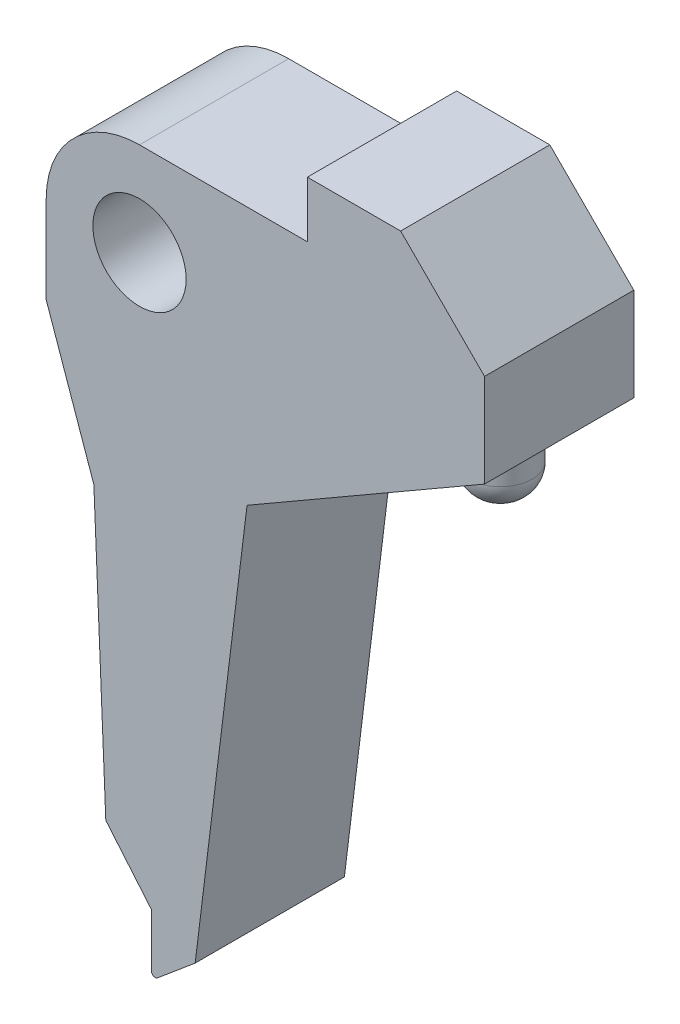
ISO-10303-21;
HEADER;
FILE_DESCRIPTION(('STEP AP214'),'2;1');
FILE_NAME('part.step','',(''),(''),'','','');
FILE_SCHEMA(('AUTOMOTIVE_DESIGN { 1 0 10303 214 1 1 1 1 }'));
ENDSEC;
DATA;
#1=APPLICATION_CONTEXT('core data for automotive mechanical design processes');
#2=APPLICATION_PROTOCOL_DEFINITION('international standard','automotive_design',2000,#1);
#3=PRODUCT_CONTEXT('',#1,'mechanical');
#4=PRODUCT('Part','Part','',(#3));
#5=PRODUCT_RELATED_PRODUCT_CATEGORY('part','',(#4));
#6=PRODUCT_DEFINITION_FORMATION('','',#4);
#7=PRODUCT_DEFINITION_CONTEXT('part definition',#1,'design');
#8=PRODUCT_DEFINITION('design','',#6,#7);
#9=PRODUCT_DEFINITION_SHAPE('','',#8);
#10=(LENGTH_UNIT() NAMED_UNIT(*) SI_UNIT(.MILLI.,.METRE.));
#11=(NAMED_UNIT(*) PLANE_ANGLE_UNIT() SI_UNIT($,.RADIAN.));
#12=(NAMED_UNIT(*) SI_UNIT($,.STERADIAN.) SOLID_ANGLE_UNIT());
#13=UNCERTAINTY_MEASURE_WITH_UNIT(LENGTH_MEASURE(1.E-05),#10,'distance_accuracy_value','');
#14=(GEOMETRIC_REPRESENTATION_CONTEXT(3) GLOBAL_UNCERTAINTY_ASSIGNED_CONTEXT((#13)) GLOBAL_UNIT_ASSIGNED_CONTEXT((#10,
#11,#12)) REPRESENTATION_CONTEXT('',''));
#15=CARTESIAN_POINT('',(0.,0.,0.));
#16=DIRECTION('',(0.,0.,1.));
#17=DIRECTION('',(1.,0.,0.));
#18=AXIS2_PLACEMENT_3D('',#15,#16,#17);
#19=CARTESIAN_POINT('',(0.839599880124929,-33.039815980547,8.));
#20=DIRECTION('',(0.,0.,-1.));
#21=DIRECTION('',(-1.,0.,0.));
#22=AXIS2_PLACEMENT_3D('',#19,#20,#21);
#23=PLANE('',#22);
#24=CARTESIAN_POINT('',(0.839599880124929,-33.039815980547,8.));
#25=DIRECTION('',(0.,0.,1.));
#26=DIRECTION('',(-1.,0.,0.));
#27=AXIS2_PLACEMENT_3D('',#24,#25,#26);
#28=CIRCLE('',#27,0.199999999999998);
#29=CARTESIAN_POINT('',(0.639599880124929,-33.039815980547,8.));
#30=VERTEX_POINT('',#29);
#31=CARTESIAN_POINT('',(0.968172025400115,-33.1930125975441,8.));
#32=VERTEX_POINT('',#31);
#33=EDGE_CURVE('E202',#30,#32,#28,.T.);
#34=ORIENTED_EDGE('',*,*,#33,.T.);
#35=DIRECTION('',(0.76598308498519,0.642860726375917,0.));
#36=VECTOR('',#35,1.);
#37=CARTESIAN_POINT('',(2.98543479971255,-31.5,8.));
#38=LINE('',#37,#36);
#39=CARTESIAN_POINT('',(2.98543479971255,-31.5,8.));
#40=VERTEX_POINT('',#39);
#41=EDGE_CURVE('E115',#32,#40,#38,.T.);
#42=ORIENTED_EDGE('',*,*,#41,.T.);
#43=DIRECTION('',(0.121869343405141,0.992546151641323,0.));
#44=VECTOR('',#43,1.);
#45=CARTESIAN_POINT('',(5.76628220120397,-8.85181539891967,8.));
#46=LINE('',#45,#44);
#47=CARTESIAN_POINT('',(5.76628220120397,-8.85181539891967,8.));
#48=VERTEX_POINT('',#47);
#49=EDGE_CURVE('E327',#40,#48,#46,.T.);
#50=ORIENTED_EDGE('',*,*,#49,.T.);
#51=DIRECTION('',(0.866025403784438,0.500000000000001,0.));
#52=VECTOR('',#51,1.);
#53=CARTESIAN_POINT('',(18.5,-1.5,8.));
#54=LINE('',#53,#52);
#55=CARTESIAN_POINT('',(18.5,-1.5,8.));
#56=VERTEX_POINT('',#55);
#57=EDGE_CURVE('E329',#48,#56,#54,.T.);
#58=ORIENTED_EDGE('',*,*,#57,.T.);
#59=DIRECTION('',(0.,1.,0.));
#60=VECTOR('',#59,1.);
#61=CARTESIAN_POINT('',(18.5,3.5,8.));
#62=LINE('',#61,#60);
#63=CARTESIAN_POINT('',(18.5,3.5,8.));
#64=VERTEX_POINT('',#63);
#65=EDGE_CURVE('E331',#56,#64,#62,.T.);
#66=ORIENTED_EDGE('',*,*,#65,.T.);
#67=DIRECTION('',(-0.707106781186551,0.707106781186544,0.));
#68=VECTOR('',#67,1.);
#69=CARTESIAN_POINT('',(14.,8.,8.));
#70=LINE('',#69,#68);
#71=CARTESIAN_POINT('',(14.,8.,8.));
#72=VERTEX_POINT('',#71);
#73=EDGE_CURVE('E337',#64,#72,#70,.T.);
#74=ORIENTED_EDGE('',*,*,#73,.T.);
#75=DIRECTION('',(-1.,0.,0.));
#76=VECTOR('',#75,1.);
#77=CARTESIAN_POINT('',(9.,8.,8.));
#78=LINE('',#77,#76);
#79=CARTESIAN_POINT('',(9.,8.,8.));
#80=VERTEX_POINT('',#79);
#81=EDGE_CURVE('E339',#72,#80,#78,.T.);
#82=ORIENTED_EDGE('',*,*,#81,.T.);
#83=DIRECTION('',(0.,-1.,0.));
#84=VECTOR('',#83,1.);
#85=CARTESIAN_POINT('',(9.,5.,8.));
#86=LINE('',#85,#84);
#87=CARTESIAN_POINT('',(9.,5.,8.));
#88=VERTEX_POINT('',#87);
#89=EDGE_CURVE('E341',#80,#88,#86,.T.);
#90=ORIENTED_EDGE('',*,*,#89,.T.);
#91=DIRECTION('',(-1.,0.,0.));
#92=VECTOR('',#91,1.);
#93=CARTESIAN_POINT('',(0.,5.,8.));
#94=LINE('',#93,#92);
#95=CARTESIAN_POINT('',(0.,5.,8.));
#96=VERTEX_POINT('',#95);
#97=EDGE_CURVE('E343',#88,#96,#94,.T.);
#98=ORIENTED_EDGE('',*,*,#97,.T.);
#99=CARTESIAN_POINT('',(0.,0.,8.));
#100=DIRECTION('',(0.,0.,1.));
#101=DIRECTION('',(1.,0.,0.));
#102=AXIS2_PLACEMENT_3D('',#99,#100,#101);
#103=CIRCLE('',#102,5.);
#104=CARTESIAN_POINT('',(-5.,0.,8.));
#105=VERTEX_POINT('',#104);
#106=EDGE_CURVE('E345',#96,#105,#103,.T.);
#107=ORIENTED_EDGE('',*,*,#106,.T.);
#108=DIRECTION('',(0.,-1.,0.));
#109=VECTOR('',#108,1.);
#110=CARTESIAN_POINT('',(-5.,-4.69657413374414,8.));
#111=LINE('',#110,#109);
#112=CARTESIAN_POINT('',(-5.,-4.69657413374414,8.));
#113=VERTEX_POINT('',#112);
#114=EDGE_CURVE('E347',#105,#113,#111,.T.);
#115=ORIENTED_EDGE('',*,*,#114,.T.);
#116=DIRECTION('',(0.330146334418636,-0.943929763208014,0.));
#117=VECTOR('',#116,1.);
#118=CARTESIAN_POINT('',(-2.44557341825096,-12.,8.));
#119=LINE('',#118,#117);
#120=CARTESIAN_POINT('',(-2.44557341825096,-12.,8.));
#121=VERTEX_POINT('',#120);
#122=EDGE_CURVE('E155',#113,#121,#119,.T.);
#123=ORIENTED_EDGE('',*,*,#122,.T.);
#124=DIRECTION('',(0.0418663292683817,-0.999123220865971,0.));
#125=VECTOR('',#124,1.);
#126=CARTESIAN_POINT('',(-1.8057349141197,-27.2694902622974,8.));
#127=LINE('',#126,#125);
#128=CARTESIAN_POINT('',(-1.8057349141197,-27.2694902622974,8.));
#129=VERTEX_POINT('',#128);
#130=EDGE_CURVE('E149',#121,#129,#127,.T.);
#131=ORIENTED_EDGE('',*,*,#130,.T.);
#132=DIRECTION('',(0.642787609686544,-0.766044443118974,0.));
#133=VECTOR('',#132,1.);
#134=CARTESIAN_POINT('',(0.639599880124929,-30.183726788434,8.));
#135=LINE('',#134,#133);
#136=CARTESIAN_POINT('',(0.639599880124929,-30.183726788434,8.));
#137=VERTEX_POINT('',#136);
#138=EDGE_CURVE('E153',#129,#137,#135,.T.);
#139=ORIENTED_EDGE('',*,*,#138,.T.);
#140=DIRECTION('',(0.,-1.,0.));
#141=VECTOR('',#140,1.);
#142=CARTESIAN_POINT('',(0.639599880124929,-33.039815980547,8.));
#143=LINE('',#142,#141);
#144=EDGE_CURVE('E50',#137,#30,#143,.T.);
#145=ORIENTED_EDGE('',*,*,#144,.T.);
#146=EDGE_LOOP('',(#34,#42,#50,#58,#66,#74,#82,#90,#98,#107,#115,#123,#131,#139,#145));
#147=FACE_BOUND('',#146,.T.);
#148=CARTESIAN_POINT('',(0.,0.,8.));
#149=DIRECTION('',(0.,0.,1.));
#150=DIRECTION('',(1.,0.,0.));
#151=AXIS2_PLACEMENT_3D('',#148,#149,#150);
#152=CIRCLE('',#151,2.5);
#153=CARTESIAN_POINT('',(2.5,0.,8.));
#154=VERTEX_POINT('',#153);
#155=EDGE_CURVE('E177',#154,#154,#152,.T.);
#156=ORIENTED_EDGE('',*,*,#155,.F.);
#157=EDGE_LOOP('',(#156));
#158=FACE_BOUND('',#157,.T.);
#159=ADVANCED_FACE('F33',(#147,#158),#23,.F.);
#160=CARTESIAN_POINT('',(0.839599880124929,-33.039815980547,0.));
#161=DIRECTION('',(0.,0.,-1.));
#162=DIRECTION('',(-1.,0.,0.));
#163=AXIS2_PLACEMENT_3D('',#160,#161,#162);
#164=PLANE('',#163);
#165=CARTESIAN_POINT('',(0.839599880124929,-33.039815980547,0.));
#166=DIRECTION('',(0.,0.,1.));
#167=DIRECTION('',(-1.,0.,0.));
#168=AXIS2_PLACEMENT_3D('',#165,#166,#167);
#169=CIRCLE('',#168,0.199999999999998);
#170=CARTESIAN_POINT('',(0.639599880124929,-33.039815980547,0.));
#171=VERTEX_POINT('',#170);
#172=CARTESIAN_POINT('',(0.968172025400115,-33.1930125975441,0.));
#173=VERTEX_POINT('',#172);
#174=EDGE_CURVE('E173',#171,#173,#169,.T.);
#175=ORIENTED_EDGE('',*,*,#174,.F.);
#176=DIRECTION('',(0.,-1.,0.));
#177=VECTOR('',#176,1.);
#178=CARTESIAN_POINT('',(0.639599880124929,-33.039815980547,0.));
#179=LINE('',#178,#177);
#180=CARTESIAN_POINT('',(0.639599880124929,-30.183726788434,0.));
#181=VERTEX_POINT('',#180);
#182=EDGE_CURVE('E106',#181,#171,#179,.T.);
#183=ORIENTED_EDGE('',*,*,#182,.F.);
#184=DIRECTION('',(0.642787609686544,-0.766044443118974,0.));
#185=VECTOR('',#184,1.);
#186=CARTESIAN_POINT('',(0.639599880124929,-30.183726788434,0.));
#187=LINE('',#186,#185);
#188=CARTESIAN_POINT('',(-1.8057349141197,-27.2694902622974,0.));
#189=VERTEX_POINT('',#188);
#190=EDGE_CURVE('E100',#189,#181,#187,.T.);
#191=ORIENTED_EDGE('',*,*,#190,.F.);
#192=DIRECTION('',(0.0418663292683817,-0.999123220865971,0.));
#193=VECTOR('',#192,1.);
#194=CARTESIAN_POINT('',(-1.8057349141197,-27.2694902622974,0.));
#195=LINE('',#194,#193);
#196=CARTESIAN_POINT('',(-2.44557341825096,-12.,0.));
#197=VERTEX_POINT('',#196);
#198=EDGE_CURVE('E163',#197,#189,#195,.T.);
#199=ORIENTED_EDGE('',*,*,#198,.F.);
#200=DIRECTION('',(0.330146334418636,-0.943929763208014,0.));
#201=VECTOR('',#200,1.);
#202=CARTESIAN_POINT('',(-2.44557341825096,-12.,0.));
#203=LINE('',#202,#201);
#204=CARTESIAN_POINT('',(-5.,-4.69657413374414,0.));
#205=VERTEX_POINT('',#204);
#206=EDGE_CURVE('E197',#205,#197,#203,.T.);
#207=ORIENTED_EDGE('',*,*,#206,.F.);
#208=DIRECTION('',(0.,-1.,0.));
#209=VECTOR('',#208,1.);
#210=CARTESIAN_POINT('',(-5.,-4.69657413374414,0.));
#211=LINE('',#210,#209);
#212=CARTESIAN_POINT('',(-5.,0.,0.));
#213=VERTEX_POINT('',#212);
#214=EDGE_CURVE('E195',#213,#205,#211,.T.);
#215=ORIENTED_EDGE('',*,*,#214,.F.);
#216=CARTESIAN_POINT('',(0.,0.,0.));
#217=DIRECTION('',(0.,0.,1.));
#218=DIRECTION('',(1.,0.,0.));
#219=AXIS2_PLACEMENT_3D('',#216,#217,#218);
#220=CIRCLE('',#219,5.);
#221=CARTESIAN_POINT('',(0.,5.,0.));
#222=VERTEX_POINT('',#221);
#223=EDGE_CURVE('E193',#222,#213,#220,.T.);
#224=ORIENTED_EDGE('',*,*,#223,.F.);
#225=DIRECTION('',(-1.,0.,0.));
#226=VECTOR('',#225,1.);
#227=CARTESIAN_POINT('',(0.,5.,0.));
#228=LINE('',#227,#226);
#229=CARTESIAN_POINT('',(9.,5.,0.));
#230=VERTEX_POINT('',#229);
#231=EDGE_CURVE('E191',#230,#222,#228,.T.);
#232=ORIENTED_EDGE('',*,*,#231,.F.);
#233=DIRECTION('',(0.,-1.,0.));
#234=VECTOR('',#233,1.);
#235=CARTESIAN_POINT('',(9.,5.,0.));
#236=LINE('',#235,#234);
#237=CARTESIAN_POINT('',(9.,8.,0.));
#238=VERTEX_POINT('',#237);
#239=EDGE_CURVE('E189',#238,#230,#236,.T.);
#240=ORIENTED_EDGE('',*,*,#239,.F.);
#241=DIRECTION('',(-1.,0.,0.));
#242=VECTOR('',#241,1.);
#243=CARTESIAN_POINT('',(9.,8.,0.));
#244=LINE('',#243,#242);
#245=CARTESIAN_POINT('',(14.,8.,0.));
#246=VERTEX_POINT('',#245);
#247=EDGE_CURVE('E187',#246,#238,#244,.T.);
#248=ORIENTED_EDGE('',*,*,#247,.F.);
#249=DIRECTION('',(-0.707106781186551,0.707106781186544,0.));
#250=VECTOR('',#249,1.);
#251=CARTESIAN_POINT('',(14.,8.,0.));
#252=LINE('',#251,#250);
#253=CARTESIAN_POINT('',(18.5,3.5,0.));
#254=VERTEX_POINT('',#253);
#255=EDGE_CURVE('E185',#254,#246,#252,.T.);
#256=ORIENTED_EDGE('',*,*,#255,.F.);
#257=DIRECTION('',(0.,1.,0.));
#258=VECTOR('',#257,1.);
#259=CARTESIAN_POINT('',(18.5,3.5,0.));
#260=LINE('',#259,#258);
#261=CARTESIAN_POINT('',(18.5,-1.5,0.));
#262=VERTEX_POINT('',#261);
#263=EDGE_CURVE('E183',#262,#254,#260,.T.);
#264=ORIENTED_EDGE('',*,*,#263,.F.);
#265=DIRECTION('',(0.866025403784438,0.500000000000001,0.));
#266=VECTOR('',#265,1.);
#267=CARTESIAN_POINT('',(18.5,-1.5,0.));
#268=LINE('',#267,#266);
#269=CARTESIAN_POINT('',(5.76628220120397,-8.85181539891967,0.));
#270=VERTEX_POINT('',#269);
#271=EDGE_CURVE('E181',#270,#262,#268,.T.);
#272=ORIENTED_EDGE('',*,*,#271,.F.);
#273=DIRECTION('',(0.121869343405141,0.992546151641323,0.));
#274=VECTOR('',#273,1.);
#275=CARTESIAN_POINT('',(5.76628220120397,-8.85181539891967,0.));
#276=LINE('',#275,#274);
#277=CARTESIAN_POINT('',(2.98543479971255,-31.5,0.));
#278=VERTEX_POINT('',#277);
#279=EDGE_CURVE('E179',#278,#270,#276,.T.);
#280=ORIENTED_EDGE('',*,*,#279,.F.);
#281=DIRECTION('',(0.76598308498519,0.642860726375917,0.));
#282=VECTOR('',#281,1.);
#283=CARTESIAN_POINT('',(2.98543479971255,-31.5,0.));
#284=LINE('',#283,#282);
#285=EDGE_CURVE('E176',#173,#278,#284,.T.);
#286=ORIENTED_EDGE('',*,*,#285,.F.);
#287=EDGE_LOOP('',(#175,#183,#191,#199,#207,#215,#224,#232,#240,#248,#256,#264,#272,#280,#286));
#288=FACE_BOUND('',#287,.T.);
#289=CARTESIAN_POINT('',(0.,0.,0.));
#290=DIRECTION('',(0.,0.,1.));
#291=DIRECTION('',(1.,0.,0.));
#292=AXIS2_PLACEMENT_3D('',#289,#290,#291);
#293=CIRCLE('',#292,2.5);
#294=CARTESIAN_POINT('',(2.5,0.,0.));
#295=VERTEX_POINT('',#294);
#296=EDGE_CURVE('E373',#295,#295,#293,.T.);
#297=ORIENTED_EDGE('',*,*,#296,.T.);
#298=EDGE_LOOP('',(#297));
#299=FACE_BOUND('',#298,.T.);
#300=ADVANCED_FACE('F254',(#288,#299),#164,.T.);
#301=CARTESIAN_POINT('',(0.839599880124929,-33.039815980547,8.));
#302=DIRECTION('',(0.,0.,-1.));
#303=DIRECTION('',(-1.,0.,0.));
#304=AXIS2_PLACEMENT_3D('',#301,#302,#303);
#305=CYLINDRICAL_SURFACE('',#304,0.199999999999998);
#306=ORIENTED_EDGE('',*,*,#174,.T.);
#307=DIRECTION('',(0.,0.,-1.));
#308=VECTOR('',#307,1.);
#309=CARTESIAN_POINT('',(0.968172025400115,-33.1930125975441,8.));
#310=LINE('',#309,#308);
#311=EDGE_CURVE('E236',#32,#173,#310,.T.);
#312=ORIENTED_EDGE('',*,*,#311,.F.);
#313=ORIENTED_EDGE('',*,*,#33,.F.);
#314=DIRECTION('',(0.,0.,-1.));
#315=VECTOR('',#314,1.);
#316=CARTESIAN_POINT('',(0.639599880124929,-33.039815980547,8.));
#317=LINE('',#316,#315);
#318=EDGE_CURVE('E169',#30,#171,#317,.T.);
#319=ORIENTED_EDGE('',*,*,#318,.T.);
#320=EDGE_LOOP('',(#306,#312,#313,#319));
#321=FACE_BOUND('',#320,.T.);
#322=ADVANCED_FACE('F259',(#321),#305,.T.);
#323=CARTESIAN_POINT('',(2.98543479971255,-31.5,8.));
#324=DIRECTION('',(-0.642860726375917,0.76598308498519,0.));
#325=DIRECTION('',(-0.76598308498519,-0.642860726375917,0.));
#326=AXIS2_PLACEMENT_3D('',#323,#324,#325);
#327=PLANE('',#326);
#328=ORIENTED_EDGE('',*,*,#285,.T.);
#329=DIRECTION('',(0.,0.,-1.));
#330=VECTOR('',#329,1.);
#331=CARTESIAN_POINT('',(2.98543479971255,-31.5,8.));
#332=LINE('',#331,#330);
#333=EDGE_CURVE('E233',#40,#278,#332,.T.);
#334=ORIENTED_EDGE('',*,*,#333,.F.);
#335=ORIENTED_EDGE('',*,*,#41,.F.);
#336=ORIENTED_EDGE('',*,*,#311,.T.);
#337=EDGE_LOOP('',(#328,#334,#335,#336));
#338=FACE_BOUND('',#337,.T.);
#339=ADVANCED_FACE('F312',(#338),#327,.F.);
#340=CARTESIAN_POINT('',(5.76628220120397,-8.85181539891967,8.));
#341=DIRECTION('',(-0.992546151641323,0.121869343405141,0.));
#342=DIRECTION('',(-0.121869343405141,-0.992546151641323,0.));
#343=AXIS2_PLACEMENT_3D('',#340,#341,#342);
#344=PLANE('',#343);
#345=ORIENTED_EDGE('',*,*,#279,.T.);
#346=DIRECTION('',(0.,0.,-1.));
#347=VECTOR('',#346,1.);
#348=CARTESIAN_POINT('',(5.76628220120397,-8.85181539891967,8.));
#349=LINE('',#348,#347);
#350=EDGE_CURVE('E230',#48,#270,#349,.T.);
#351=ORIENTED_EDGE('',*,*,#350,.F.);
#352=ORIENTED_EDGE('',*,*,#49,.F.);
#353=ORIENTED_EDGE('',*,*,#333,.T.);
#354=EDGE_LOOP('',(#345,#351,#352,#353));
#355=FACE_BOUND('',#354,.T.);
#356=ADVANCED_FACE('F308',(#355),#344,.F.);
#357=CARTESIAN_POINT('',(18.5,-1.5,8.));
#358=DIRECTION('',(-0.500000000000001,0.866025403784438,0.));
#359=DIRECTION('',(-0.866025403784438,-0.500000000000001,0.));
#360=AXIS2_PLACEMENT_3D('',#357,#358,#359);
#361=PLANE('',#360);
#362=CARTESIAN_POINT('',(15.3496087592222,-3.31887923091571,4.));
#363=DIRECTION('',(-0.500000000000001,0.866025403784438,0.));
#364=DIRECTION('',(0.866025403784438,0.500000000000001,0.));
#365=AXIS2_PLACEMENT_3D('',#362,#363,#364);
#366=ELLIPSE('',#365,2.88675134594813,2.5);
#367=CARTESIAN_POINT('',(17.8496087592222,-1.87550355794164,4.));
#368=VERTEX_POINT('',#367);
#369=EDGE_CURVE('E376',#368,#368,#366,.F.);
#370=ORIENTED_EDGE('',*,*,#369,.F.);
#371=EDGE_LOOP('',(#370));
#372=FACE_BOUND('',#371,.T.);
#373=ORIENTED_EDGE('',*,*,#271,.T.);
#374=DIRECTION('',(0.,0.,-1.));
#375=VECTOR('',#374,1.);
#376=CARTESIAN_POINT('',(18.5,-1.5,8.));
#377=LINE('',#376,#375);
#378=EDGE_CURVE('E227',#56,#262,#377,.T.);
#379=ORIENTED_EDGE('',*,*,#378,.F.);
#380=ORIENTED_EDGE('',*,*,#57,.F.);
#381=ORIENTED_EDGE('',*,*,#350,.T.);
#382=EDGE_LOOP('',(#373,#379,#380,#381));
#383=FACE_BOUND('',#382,.T.);
#384=ADVANCED_FACE('F304',(#372,#383),#361,.F.);
#385=CARTESIAN_POINT('',(18.5,3.5,8.));
#386=DIRECTION('',(-1.,0.,0.));
#387=DIRECTION('',(0.,0.,1.));
#388=AXIS2_PLACEMENT_3D('',#385,#386,#387);
#389=PLANE('',#388);
#390=ORIENTED_EDGE('',*,*,#263,.T.);
#391=DIRECTION('',(0.,0.,-1.));
#392=VECTOR('',#391,1.);
#393=CARTESIAN_POINT('',(18.5,3.5,8.));
#394=LINE('',#393,#392);
#395=EDGE_CURVE('E224',#64,#254,#394,.T.);
#396=ORIENTED_EDGE('',*,*,#395,.F.);
#397=ORIENTED_EDGE('',*,*,#65,.F.);
#398=ORIENTED_EDGE('',*,*,#378,.T.);
#399=EDGE_LOOP('',(#390,#396,#397,#398));
#400=FACE_BOUND('',#399,.T.);
#401=ADVANCED_FACE('F300',(#400),#389,.F.);
#402=CARTESIAN_POINT('',(14.,8.,8.));
#403=DIRECTION('',(-0.707106781186544,-0.707106781186552,0.));
#404=DIRECTION('',(0.707106781186552,-0.707106781186544,0.));
#405=AXIS2_PLACEMENT_3D('',#402,#403,#404);
#406=PLANE('',#405);
#407=ORIENTED_EDGE('',*,*,#255,.T.);
#408=DIRECTION('',(0.,0.,-1.));
#409=VECTOR('',#408,1.);
#410=CARTESIAN_POINT('',(14.,8.,8.));
#411=LINE('',#410,#409);
#412=EDGE_CURVE('E221',#72,#246,#411,.T.);
#413=ORIENTED_EDGE('',*,*,#412,.F.);
#414=ORIENTED_EDGE('',*,*,#73,.F.);
#415=ORIENTED_EDGE('',*,*,#395,.T.);
#416=EDGE_LOOP('',(#407,#413,#414,#415));
#417=FACE_BOUND('',#416,.T.);
#418=ADVANCED_FACE('F296',(#417),#406,.F.);
#419=CARTESIAN_POINT('',(9.,8.,8.));
#420=DIRECTION('',(0.,-1.,0.));
#421=DIRECTION('',(0.,0.,-1.));
#422=AXIS2_PLACEMENT_3D('',#419,#420,#421);
#423=PLANE('',#422);
#424=ORIENTED_EDGE('',*,*,#247,.T.);
#425=DIRECTION('',(0.,0.,-1.));
#426=VECTOR('',#425,1.);
#427=CARTESIAN_POINT('',(9.,8.,8.));
#428=LINE('',#427,#426);
#429=EDGE_CURVE('E218',#80,#238,#428,.T.);
#430=ORIENTED_EDGE('',*,*,#429,.F.);
#431=ORIENTED_EDGE('',*,*,#81,.F.);
#432=ORIENTED_EDGE('',*,*,#412,.T.);
#433=EDGE_LOOP('',(#424,#430,#431,#432));
#434=FACE_BOUND('',#433,.T.);
#435=ADVANCED_FACE('F292',(#434),#423,.F.);
#436=CARTESIAN_POINT('',(9.,5.,8.));
#437=DIRECTION('',(1.,0.,0.));
#438=DIRECTION('',(0.,0.,-1.));
#439=AXIS2_PLACEMENT_3D('',#436,#437,#438);
#440=PLANE('',#439);
#441=ORIENTED_EDGE('',*,*,#239,.T.);
#442=DIRECTION('',(0.,0.,-1.));
#443=VECTOR('',#442,1.);
#444=CARTESIAN_POINT('',(9.,5.,8.));
#445=LINE('',#444,#443);
#446=EDGE_CURVE('E215',#88,#230,#445,.T.);
#447=ORIENTED_EDGE('',*,*,#446,.F.);
#448=ORIENTED_EDGE('',*,*,#89,.F.);
#449=ORIENTED_EDGE('',*,*,#429,.T.);
#450=EDGE_LOOP('',(#441,#447,#448,#449));
#451=FACE_BOUND('',#450,.T.);
#452=ADVANCED_FACE('F288',(#451),#440,.F.);
#453=CARTESIAN_POINT('',(0.,5.,8.));
#454=DIRECTION('',(0.,-1.,0.));
#455=DIRECTION('',(0.,0.,-1.));
#456=AXIS2_PLACEMENT_3D('',#453,#454,#455);
#457=PLANE('',#456);
#458=ORIENTED_EDGE('',*,*,#231,.T.);
#459=DIRECTION('',(0.,0.,-1.));
#460=VECTOR('',#459,1.);
#461=CARTESIAN_POINT('',(0.,5.,8.));
#462=LINE('',#461,#460);
#463=EDGE_CURVE('E212',#96,#222,#462,.T.);
#464=ORIENTED_EDGE('',*,*,#463,.F.);
#465=ORIENTED_EDGE('',*,*,#97,.F.);
#466=ORIENTED_EDGE('',*,*,#446,.T.);
#467=EDGE_LOOP('',(#458,#464,#465,#466));
#468=FACE_BOUND('',#467,.T.);
#469=ADVANCED_FACE('F284',(#468),#457,.F.);
#470=CARTESIAN_POINT('',(0.,0.,8.));
#471=DIRECTION('',(0.,0.,-1.));
#472=DIRECTION('',(-1.,0.,0.));
#473=AXIS2_PLACEMENT_3D('',#470,#471,#472);
#474=CYLINDRICAL_SURFACE('',#473,5.);
#475=ORIENTED_EDGE('',*,*,#223,.T.);
#476=DIRECTION('',(0.,0.,-1.));
#477=VECTOR('',#476,1.);
#478=CARTESIAN_POINT('',(-5.,0.,8.));
#479=LINE('',#478,#477);
#480=EDGE_CURVE('E209',#105,#213,#479,.T.);
#481=ORIENTED_EDGE('',*,*,#480,.F.);
#482=ORIENTED_EDGE('',*,*,#106,.F.);
#483=ORIENTED_EDGE('',*,*,#463,.T.);
#484=EDGE_LOOP('',(#475,#481,#482,#483));
#485=FACE_BOUND('',#484,.T.);
#486=ADVANCED_FACE('F280',(#485),#474,.T.);
#487=CARTESIAN_POINT('',(-5.,-4.69657413374414,8.));
#488=DIRECTION('',(1.,0.,0.));
#489=DIRECTION('',(0.,0.,-1.));
#490=AXIS2_PLACEMENT_3D('',#487,#488,#489);
#491=PLANE('',#490);
#492=ORIENTED_EDGE('',*,*,#214,.T.);
#493=DIRECTION('',(0.,0.,-1.));
#494=VECTOR('',#493,1.);
#495=CARTESIAN_POINT('',(-5.,-4.69657413374414,8.));
#496=LINE('',#495,#494);
#497=EDGE_CURVE('E206',#113,#205,#496,.T.);
#498=ORIENTED_EDGE('',*,*,#497,.F.);
#499=ORIENTED_EDGE('',*,*,#114,.F.);
#500=ORIENTED_EDGE('',*,*,#480,.T.);
#501=EDGE_LOOP('',(#492,#498,#499,#500));
#502=FACE_BOUND('',#501,.T.);
#503=ADVANCED_FACE('F276',(#502),#491,.F.);
#504=CARTESIAN_POINT('',(-2.44557341825096,-12.,8.));
#505=DIRECTION('',(0.943929763208014,0.330146334418636,0.));
#506=DIRECTION('',(-0.330146334418636,0.943929763208014,0.));
#507=AXIS2_PLACEMENT_3D('',#504,#505,#506);
#508=PLANE('',#507);
#509=ORIENTED_EDGE('',*,*,#206,.T.);
#510=DIRECTION('',(0.,0.,-1.));
#511=VECTOR('',#510,1.);
#512=CARTESIAN_POINT('',(-2.44557341825096,-12.,8.));
#513=LINE('',#512,#511);
#514=EDGE_CURVE('E164',#121,#197,#513,.T.);
#515=ORIENTED_EDGE('',*,*,#514,.F.);
#516=ORIENTED_EDGE('',*,*,#122,.F.);
#517=ORIENTED_EDGE('',*,*,#497,.T.);
#518=EDGE_LOOP('',(#509,#515,#516,#517));
#519=FACE_BOUND('',#518,.T.);
#520=ADVANCED_FACE('F273',(#519),#508,.F.);
#521=CARTESIAN_POINT('',(-1.8057349141197,-27.2694902622974,8.));
#522=DIRECTION('',(0.999123220865971,0.0418663292683817,0.));
#523=DIRECTION('',(-0.0418663292683817,0.999123220865971,0.));
#524=AXIS2_PLACEMENT_3D('',#521,#522,#523);
#525=PLANE('',#524);
#526=ORIENTED_EDGE('',*,*,#198,.T.);
#527=DIRECTION('',(0.,0.,-1.));
#528=VECTOR('',#527,1.);
#529=CARTESIAN_POINT('',(-1.8057349141197,-27.2694902622974,8.));
#530=LINE('',#529,#528);
#531=EDGE_CURVE('E160',#129,#189,#530,.T.);
#532=ORIENTED_EDGE('',*,*,#531,.F.);
#533=ORIENTED_EDGE('',*,*,#130,.F.);
#534=ORIENTED_EDGE('',*,*,#514,.T.);
#535=EDGE_LOOP('',(#526,#532,#533,#534));
#536=FACE_BOUND('',#535,.T.);
#537=ADVANCED_FACE('F161',(#536),#525,.F.);
#538=CARTESIAN_POINT('',(0.639599880124929,-30.183726788434,8.));
#539=DIRECTION('',(0.766044443118974,0.642787609686544,0.));
#540=DIRECTION('',(-0.642787609686544,0.766044443118974,0.));
#541=AXIS2_PLACEMENT_3D('',#538,#539,#540);
#542=PLANE('',#541);
#543=ORIENTED_EDGE('',*,*,#190,.T.);
#544=DIRECTION('',(0.,0.,-1.));
#545=VECTOR('',#544,1.);
#546=CARTESIAN_POINT('',(0.639599880124929,-30.183726788434,8.));
#547=LINE('',#546,#545);
#548=EDGE_CURVE('E165',#137,#181,#547,.T.);
#549=ORIENTED_EDGE('',*,*,#548,.F.);
#550=ORIENTED_EDGE('',*,*,#138,.F.);
#551=ORIENTED_EDGE('',*,*,#531,.T.);
#552=EDGE_LOOP('',(#543,#549,#550,#551));
#553=FACE_BOUND('',#552,.T.);
#554=ADVANCED_FACE('F167',(#553),#542,.F.);
#555=CARTESIAN_POINT('',(0.639599880124929,-33.039815980547,8.));
#556=DIRECTION('',(1.,0.,0.));
#557=DIRECTION('',(0.,0.,-1.));
#558=AXIS2_PLACEMENT_3D('',#555,#556,#557);
#559=PLANE('',#558);
#560=ORIENTED_EDGE('',*,*,#182,.T.);
#561=ORIENTED_EDGE('',*,*,#318,.F.);
#562=ORIENTED_EDGE('',*,*,#144,.F.);
#563=ORIENTED_EDGE('',*,*,#548,.T.);
#564=EDGE_LOOP('',(#560,#561,#562,#563));
#565=FACE_BOUND('',#564,.T.);
#566=ADVANCED_FACE('F266',(#565),#559,.F.);
#567=CARTESIAN_POINT('',(0.,0.,8.));
#568=DIRECTION('',(0.,0.,-1.));
#569=DIRECTION('',(-1.,0.,0.));
#570=AXIS2_PLACEMENT_3D('',#567,#568,#569);
#571=CYLINDRICAL_SURFACE('',#570,2.5);
#572=ORIENTED_EDGE('',*,*,#155,.T.);
#573=EDGE_LOOP('',(#572));
#574=FACE_BOUND('',#573,.T.);
#575=ORIENTED_EDGE('',*,*,#296,.F.);
#576=EDGE_LOOP('',(#575));
#577=FACE_BOUND('',#576,.T.);
#578=ADVANCED_FACE('F263',(#574,#577),#571,.F.);
#579=CARTESIAN_POINT('',(15.3496087592222,-33.240815980547,4.));
#580=DIRECTION('',(0.,1.,0.));
#581=DIRECTION('',(0.,0.,1.));
#582=AXIS2_PLACEMENT_3D('',#579,#580,#581);
#583=CYLINDRICAL_SURFACE('',#582,2.5);
#584=CARTESIAN_POINT('',(15.3496087592222,-1.5,4.));
#585=DIRECTION('',(0.,1.,0.));
#586=DIRECTION('',(0.,0.,1.));
#587=AXIS2_PLACEMENT_3D('',#584,#585,#586);
#588=CIRCLE('',#587,2.5);
#589=CARTESIAN_POINT('',(15.3496087592222,-1.5,6.5));
#590=VERTEX_POINT('',#589);
#591=EDGE_CURVE('E381',#590,#590,#588,.T.);
#592=ORIENTED_EDGE('',*,*,#591,.T.);
#593=EDGE_LOOP('',(#592));
#594=FACE_BOUND('',#593,.T.);
#595=ORIENTED_EDGE('',*,*,#369,.T.);
#596=EDGE_LOOP('',(#595));
#597=FACE_BOUND('',#596,.T.);
#598=ADVANCED_FACE('F385',(#594,#597),#583,.F.);
#599=CARTESIAN_POINT('',(15.3496087592222,-1.5,4.));
#600=DIRECTION('',(0.,1.,0.));
#601=DIRECTION('',(0.,0.,1.));
#602=AXIS2_PLACEMENT_3D('',#599,#600,#601);
#603=PLANE('',#602);
#604=CARTESIAN_POINT('',(15.3496087592222,-1.5,4.));
#605=DIRECTION('',(0.,1.,0.));
#606=DIRECTION('',(0.,0.,1.));
#607=AXIS2_PLACEMENT_3D('',#604,#605,#606);
#608=CIRCLE('',#607,1.7);
#609=CARTESIAN_POINT('',(15.3496087592222,-1.5,5.7));
#610=VERTEX_POINT('',#609);
#611=EDGE_CURVE('E238',#610,#610,#608,.F.);
#612=ORIENTED_EDGE('',*,*,#611,.F.);
#613=EDGE_LOOP('',(#612));
#614=FACE_BOUND('',#613,.T.);
#615=ORIENTED_EDGE('',*,*,#591,.F.);
#616=EDGE_LOOP('',(#615));
#617=FACE_BOUND('',#616,.T.);
#618=ADVANCED_FACE('F388',(#614,#617),#603,.F.);
#619=CARTESIAN_POINT('',(15.3496087592222,-5.5,4.));
#620=DIRECTION('',(0.,1.,0.));
#621=DIRECTION('',(0.,0.,1.));
#622=AXIS2_PLACEMENT_3D('',#619,#620,#621);
#623=CYLINDRICAL_SURFACE('',#622,1.7);
#624=CARTESIAN_POINT('',(15.3496087592222,-4.,4.));
#625=DIRECTION('',(0.,-1.,0.));
#626=DIRECTION('',(0.,0.,-1.));
#627=AXIS2_PLACEMENT_3D('',#624,#625,#626);
#628=CIRCLE('',#627,1.7);
#629=CARTESIAN_POINT('',(15.3496087592222,-4.,2.3));
#630=VERTEX_POINT('',#629);
#631=EDGE_CURVE('E11',#630,#630,#628,.F.);
#632=ORIENTED_EDGE('',*,*,#631,.T.);
#633=EDGE_LOOP('',(#632));
#634=FACE_BOUND('',#633,.T.);
#635=ORIENTED_EDGE('',*,*,#611,.T.);
#636=EDGE_LOOP('',(#635));
#637=FACE_BOUND('',#636,.T.);
#638=ADVANCED_FACE('F250',(#634,#637),#623,.T.);
#639=CARTESIAN_POINT('',(15.3496087592222,-5.5,4.));
#640=DIRECTION('',(0.,-1.,0.));
#641=DIRECTION('',(0.,0.,-1.));
#642=AXIS2_PLACEMENT_3D('',#639,#640,#641);
#643=PLANE('',#642);
#644=CARTESIAN_POINT('',(15.3496087592222,-5.5,4.));
#645=DIRECTION('',(0.,-1.,0.));
#646=DIRECTION('',(0.,0.,-1.));
#647=AXIS2_PLACEMENT_3D('',#644,#645,#646);
#648=CIRCLE('',#647,0.199999999999998);
#649=CARTESIAN_POINT('',(15.3496087592222,-5.5,3.8));
#650=VERTEX_POINT('',#649);
#651=EDGE_CURVE('E42',#650,#650,#648,.T.);
#652=ORIENTED_EDGE('',*,*,#651,.T.);
#653=EDGE_LOOP('',(#652));
#654=FACE_BOUND('',#653,.T.);
#655=ADVANCED_FACE('F243',(#654),#643,.T.);
#656=CARTESIAN_POINT('',(15.3496087592222,-4.,4.));
#657=DIRECTION('',(0.,-1.,0.));
#658=DIRECTION('',(0.,0.,-1.));
#659=AXIS2_PLACEMENT_3D('',#656,#657,#658);
#660=DEGENERATE_TOROIDAL_SURFACE('',#659,0.199999999999998,1.5,.T.);
#661=ORIENTED_EDGE('',*,*,#631,.F.);
#662=EDGE_LOOP('',(#661));
#663=FACE_BOUND('',#662,.T.);
#664=ORIENTED_EDGE('',*,*,#651,.F.);
#665=EDGE_LOOP('',(#664));
#666=FACE_BOUND('',#665,.T.);
#667=ADVANCED_FACE('F35',(#663,#666),#660,.T.);
#668=CLOSED_SHELL('',(#159,#300,#322,#339,#356,#384,#401,#418,#435,#452,#469,#486,#503,#520,
#537,#554,#566,#578,#598,#618,#638,#655,#667));
#669=MANIFOLD_SOLID_BREP('B2',#668);
#670=ADVANCED_BREP_SHAPE_REPRESENTATION('',(#18,#669),#14);
#671=SHAPE_DEFINITION_REPRESENTATION(#9,#670);
ENDSEC;
END-ISO-10303-21;
